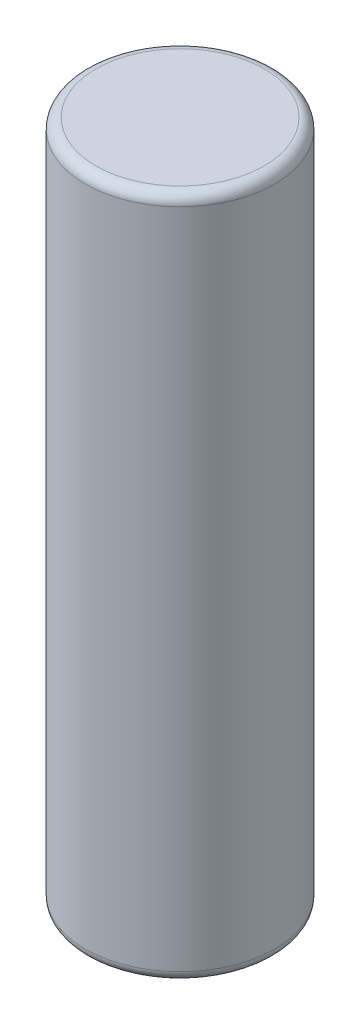
ISO-10303-21;
HEADER;
FILE_DESCRIPTION(('STEP AP214'),'2;1');
FILE_NAME('part.step','',(''),(''),'','','');
FILE_SCHEMA(('AUTOMOTIVE_DESIGN { 1 0 10303 214 1 1 1 1 }'));
ENDSEC;
DATA;
#1=APPLICATION_CONTEXT('core data for automotive mechanical design processes');
#2=APPLICATION_PROTOCOL_DEFINITION('international standard','automotive_design',2000,#1);
#3=PRODUCT_CONTEXT('',#1,'mechanical');
#4=PRODUCT('Part','Part','',(#3));
#5=PRODUCT_RELATED_PRODUCT_CATEGORY('part','',(#4));
#6=PRODUCT_DEFINITION_FORMATION('','',#4);
#7=PRODUCT_DEFINITION_CONTEXT('part definition',#1,'design');
#8=PRODUCT_DEFINITION('design','',#6,#7);
#9=PRODUCT_DEFINITION_SHAPE('','',#8);
#10=(LENGTH_UNIT() NAMED_UNIT(*) SI_UNIT(.MILLI.,.METRE.));
#11=(NAMED_UNIT(*) PLANE_ANGLE_UNIT() SI_UNIT($,.RADIAN.));
#12=(NAMED_UNIT(*) SI_UNIT($,.STERADIAN.) SOLID_ANGLE_UNIT());
#13=UNCERTAINTY_MEASURE_WITH_UNIT(LENGTH_MEASURE(1.E-05),#10,'distance_accuracy_value','');
#14=(GEOMETRIC_REPRESENTATION_CONTEXT(3) GLOBAL_UNCERTAINTY_ASSIGNED_CONTEXT((#13)) GLOBAL_UNIT_ASSIGNED_CONTEXT((#10,
#11,#12)) REPRESENTATION_CONTEXT('',''));
#15=CARTESIAN_POINT('',(0.,0.,0.));
#16=DIRECTION('',(0.,0.,1.));
#17=DIRECTION('',(1.,0.,0.));
#18=AXIS2_PLACEMENT_3D('',#15,#16,#17);
#19=CARTESIAN_POINT('',(366.998911685369,921.709797624498,-847.874537459574));
#20=DIRECTION('',(0.,-1.,0.));
#21=DIRECTION('',(0.,0.,-1.));
#22=AXIS2_PLACEMENT_3D('',#19,#20,#21);
#23=CYLINDRICAL_SURFACE('',#22,89.9999999999999);
#24=CARTESIAN_POINT('',(366.998911685369,911.709797624498,-847.874537459574));
#25=DIRECTION('',(0.,1.,0.));
#26=DIRECTION('',(0.,0.,1.));
#27=AXIS2_PLACEMENT_3D('',#24,#25,#26);
#28=CIRCLE('',#27,89.9999999999999);
#29=CARTESIAN_POINT('',(366.998911685369,911.709797624498,-757.874537459574));
#30=VERTEX_POINT('',#29);
#31=EDGE_CURVE('E46',#30,#30,#28,.F.);
#32=ORIENTED_EDGE('',*,*,#31,.T.);
#33=EDGE_LOOP('',(#32));
#34=FACE_BOUND('',#33,.T.);
#35=CARTESIAN_POINT('',(366.998911685369,281.709797624498,-847.874537459575));
#36=DIRECTION('',(0.,1.,0.));
#37=DIRECTION('',(0.,0.,1.));
#38=AXIS2_PLACEMENT_3D('',#35,#36,#37);
#39=CIRCLE('',#38,89.9999999999999);
#40=CARTESIAN_POINT('',(366.998911685369,281.709797624498,-757.874537459575));
#41=VERTEX_POINT('',#40);
#42=EDGE_CURVE('E50',#41,#41,#39,.T.);
#43=ORIENTED_EDGE('',*,*,#42,.T.);
#44=EDGE_LOOP('',(#43));
#45=FACE_BOUND('',#44,.T.);
#46=ADVANCED_FACE('F39',(#34,#45),#23,.T.);
#47=CARTESIAN_POINT('',(366.998911685369,921.709797624498,-847.874537459574));
#48=DIRECTION('',(0.,1.,0.));
#49=DIRECTION('',(0.,0.,1.));
#50=AXIS2_PLACEMENT_3D('',#47,#48,#49);
#51=PLANE('',#50);
#52=CARTESIAN_POINT('',(366.998911685369,921.709797624498,-847.874537459574));
#53=DIRECTION('',(0.,1.,0.));
#54=DIRECTION('',(0.,0.,1.));
#55=AXIS2_PLACEMENT_3D('',#52,#53,#54);
#56=CIRCLE('',#55,79.9999999999999);
#57=CARTESIAN_POINT('',(366.998911685369,921.709797624498,-767.874537459574));
#58=VERTEX_POINT('',#57);
#59=EDGE_CURVE('E54',#58,#58,#56,.T.);
#60=ORIENTED_EDGE('',*,*,#59,.T.);
#61=EDGE_LOOP('',(#60));
#62=FACE_BOUND('',#61,.T.);
#63=ADVANCED_FACE('F60',(#62),#51,.T.);
#64=CARTESIAN_POINT('',(366.998911685369,271.709797624498,-847.874537459575));
#65=DIRECTION('',(0.,1.,0.));
#66=DIRECTION('',(0.,0.,1.));
#67=AXIS2_PLACEMENT_3D('',#64,#65,#66);
#68=PLANE('',#67);
#69=CARTESIAN_POINT('',(366.998911685369,271.709797624498,-847.874537459575));
#70=DIRECTION('',(0.,1.,0.));
#71=DIRECTION('',(0.,0.,1.));
#72=AXIS2_PLACEMENT_3D('',#69,#70,#71);
#73=CIRCLE('',#72,79.9999999999999);
#74=CARTESIAN_POINT('',(366.998911685369,271.709797624498,-767.874537459575));
#75=VERTEX_POINT('',#74);
#76=EDGE_CURVE('E10',#75,#75,#73,.F.);
#77=ORIENTED_EDGE('',*,*,#76,.T.);
#78=EDGE_LOOP('',(#77));
#79=FACE_BOUND('',#78,.T.);
#80=ADVANCED_FACE('F64',(#79),#68,.F.);
#81=CARTESIAN_POINT('',(366.998911685369,911.709797624498,-847.874537459574));
#82=DIRECTION('',(0.,1.,0.));
#83=DIRECTION('',(0.,0.,1.));
#84=AXIS2_PLACEMENT_3D('',#81,#82,#83);
#85=TOROIDAL_SURFACE('',#84,79.9999999999999,10.);
#86=ORIENTED_EDGE('',*,*,#31,.F.);
#87=EDGE_LOOP('',(#86));
#88=FACE_BOUND('',#87,.T.);
#89=ORIENTED_EDGE('',*,*,#59,.F.);
#90=EDGE_LOOP('',(#89));
#91=FACE_BOUND('',#90,.T.);
#92=ADVANCED_FACE('F62',(#88,#91),#85,.T.);
#93=CARTESIAN_POINT('',(366.998911685369,281.709797624498,-847.874537459575));
#94=DIRECTION('',(0.,1.,0.));
#95=DIRECTION('',(0.,0.,1.));
#96=AXIS2_PLACEMENT_3D('',#93,#94,#95);
#97=TOROIDAL_SURFACE('',#96,79.9999999999999,10.);
#98=ORIENTED_EDGE('',*,*,#76,.F.);
#99=EDGE_LOOP('',(#98));
#100=FACE_BOUND('',#99,.T.);
#101=ORIENTED_EDGE('',*,*,#42,.F.);
#102=EDGE_LOOP('',(#101));
#103=FACE_BOUND('',#102,.T.);
#104=ADVANCED_FACE('F41',(#100,#103),#97,.T.);
#105=CLOSED_SHELL('',(#46,#63,#80,#92,#104));
#106=MANIFOLD_SOLID_BREP('B2',#105);
#107=ADVANCED_BREP_SHAPE_REPRESENTATION('',(#18,#106),#14);
#108=SHAPE_DEFINITION_REPRESENTATION(#9,#107);
ENDSEC;
END-ISO-10303-21;
